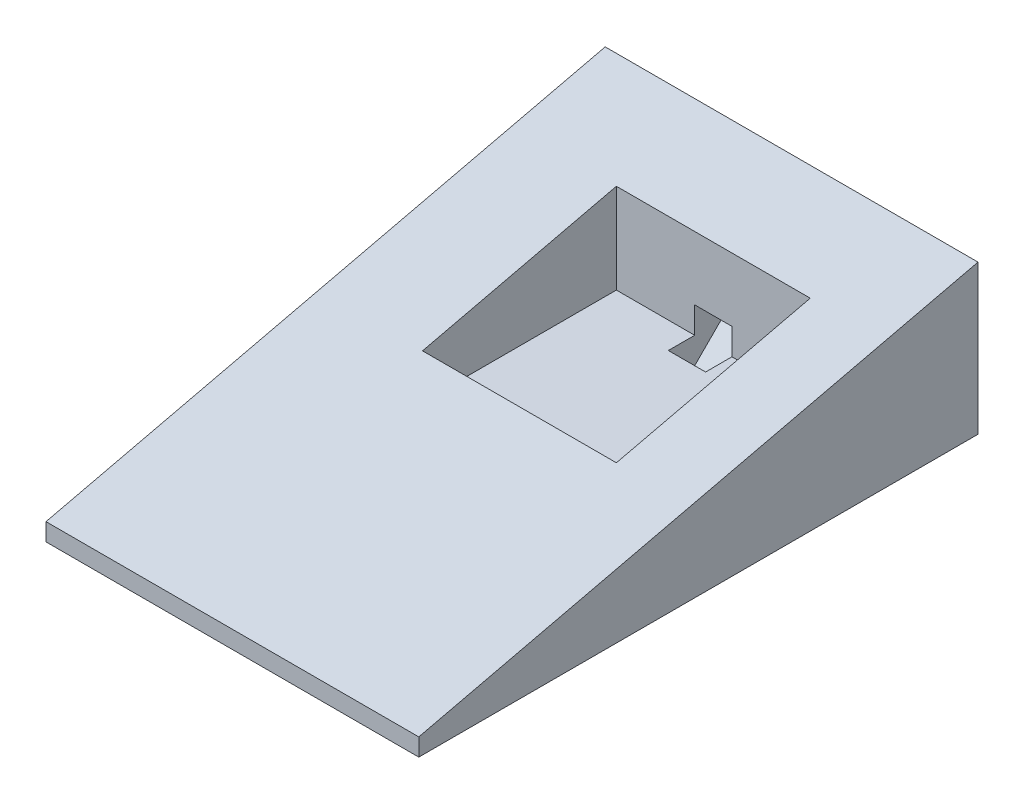
ISO-10303-21;
HEADER;
FILE_DESCRIPTION(('STEP AP214'),'2;1');
FILE_NAME('part.step','',(''),(''),'','','');
FILE_SCHEMA(('AUTOMOTIVE_DESIGN { 1 0 10303 214 1 1 1 1 }'));
ENDSEC;
DATA;
#1=APPLICATION_CONTEXT('core data for automotive mechanical design processes');
#2=APPLICATION_PROTOCOL_DEFINITION('international standard','automotive_design',2000,#1);
#3=PRODUCT_CONTEXT('',#1,'mechanical');
#4=PRODUCT('Part','Part','',(#3));
#5=PRODUCT_RELATED_PRODUCT_CATEGORY('part','',(#4));
#6=PRODUCT_DEFINITION_FORMATION('','',#4);
#7=PRODUCT_DEFINITION_CONTEXT('part definition',#1,'design');
#8=PRODUCT_DEFINITION('design','',#6,#7);
#9=PRODUCT_DEFINITION_SHAPE('','',#8);
#10=(LENGTH_UNIT() NAMED_UNIT(*) SI_UNIT(.MILLI.,.METRE.));
#11=(NAMED_UNIT(*) PLANE_ANGLE_UNIT() SI_UNIT($,.RADIAN.));
#12=(NAMED_UNIT(*) SI_UNIT($,.STERADIAN.) SOLID_ANGLE_UNIT());
#13=UNCERTAINTY_MEASURE_WITH_UNIT(LENGTH_MEASURE(1.E-05),#10,'distance_accuracy_value','');
#14=(GEOMETRIC_REPRESENTATION_CONTEXT(3) GLOBAL_UNCERTAINTY_ASSIGNED_CONTEXT((#13)) GLOBAL_UNIT_ASSIGNED_CONTEXT((#10,
#11,#12)) REPRESENTATION_CONTEXT('',''));
#15=CARTESIAN_POINT('',(0.,0.,0.));
#16=DIRECTION('',(0.,0.,1.));
#17=DIRECTION('',(1.,0.,0.));
#18=AXIS2_PLACEMENT_3D('',#15,#16,#17);
#19=CARTESIAN_POINT('',(0.,10.,0.));
#20=DIRECTION('',(0.,-1.,0.));
#21=DIRECTION('',(0.,0.,-1.));
#22=AXIS2_PLACEMENT_3D('',#19,#20,#21);
#23=PLANE('',#22);
#24=DIRECTION('',(0.,0.,1.));
#25=VECTOR('',#24,1.);
#26=CARTESIAN_POINT('',(-1.00000000000001,10.,0.));
#27=LINE('',#26,#25);
#28=CARTESIAN_POINT('',(-1.00000000000001,10.,-50.));
#29=VERTEX_POINT('',#28);
#30=CARTESIAN_POINT('',(-1.00000000000001,10.,-42.9289321881345));
#31=VERTEX_POINT('',#30);
#32=EDGE_CURVE('E135',#29,#31,#27,.T.);
#33=ORIENTED_EDGE('',*,*,#32,.F.);
#34=DIRECTION('',(-1.,0.,0.));
#35=VECTOR('',#34,1.);
#36=CARTESIAN_POINT('',(-22.,10.,-50.));
#37=LINE('',#36,#35);
#38=CARTESIAN_POINT('',(-22.,10.,-50.));
#39=VERTEX_POINT('',#38);
#40=EDGE_CURVE('E180',#29,#39,#37,.T.);
#41=ORIENTED_EDGE('',*,*,#40,.T.);
#42=DIRECTION('',(0.,0.,1.));
#43=VECTOR('',#42,1.);
#44=CARTESIAN_POINT('',(-22.,10.,2.00000000000002));
#45=LINE('',#44,#43);
#46=CARTESIAN_POINT('',(-22.,10.,2.00000000000002));
#47=VERTEX_POINT('',#46);
#48=EDGE_CURVE('E184',#39,#47,#45,.T.);
#49=ORIENTED_EDGE('',*,*,#48,.T.);
#50=DIRECTION('',(1.,0.,0.));
#51=VECTOR('',#50,1.);
#52=CARTESIAN_POINT('',(-22.,10.,2.00000000000002));
#53=LINE('',#52,#51);
#54=CARTESIAN_POINT('',(30.,10.,2.00000000000002));
#55=VERTEX_POINT('',#54);
#56=EDGE_CURVE('E187',#47,#55,#53,.T.);
#57=ORIENTED_EDGE('',*,*,#56,.T.);
#58=DIRECTION('',(0.,0.,-1.));
#59=VECTOR('',#58,1.);
#60=CARTESIAN_POINT('',(30.,10.,2.00000000000002));
#61=LINE('',#60,#59);
#62=CARTESIAN_POINT('',(30.,10.,-50.));
#63=VERTEX_POINT('',#62);
#64=EDGE_CURVE('E177',#55,#63,#61,.T.);
#65=ORIENTED_EDGE('',*,*,#64,.T.);
#66=CARTESIAN_POINT('',(8.99999999999998,10.,-50.));
#67=VERTEX_POINT('',#66);
#68=EDGE_CURVE('E181',#63,#67,#37,.T.);
#69=ORIENTED_EDGE('',*,*,#68,.T.);
#70=DIRECTION('',(0.,0.,-1.));
#71=VECTOR('',#70,1.);
#72=CARTESIAN_POINT('',(8.99999999999998,10.,0.));
#73=LINE('',#72,#71);
#74=CARTESIAN_POINT('',(8.99999999999998,10.,-42.9289321881345));
#75=VERTEX_POINT('',#74);
#76=EDGE_CURVE('E138',#75,#67,#73,.T.);
#77=ORIENTED_EDGE('',*,*,#76,.F.);
#78=DIRECTION('',(1.,0.,0.));
#79=VECTOR('',#78,1.);
#80=CARTESIAN_POINT('',(0.,10.,-42.9289321881345));
#81=LINE('',#80,#79);
#82=EDGE_CURVE('E11',#31,#75,#81,.T.);
#83=ORIENTED_EDGE('',*,*,#82,.F.);
#84=EDGE_LOOP('',(#33,#41,#49,#57,#65,#69,#77,#83));
#85=FACE_BOUND('',#84,.T.);
#86=ADVANCED_FACE('F33',(#85),#23,.F.);
#87=CARTESIAN_POINT('',(-22.,10.,-50.));
#88=DIRECTION('',(0.,0.,-1.));
#89=DIRECTION('',(-1.,0.,0.));
#90=AXIS2_PLACEMENT_3D('',#87,#88,#89);
#91=PLANE('',#90);
#92=DIRECTION('',(0.,-1.,0.));
#93=VECTOR('',#92,1.);
#94=CARTESIAN_POINT('',(-1.00000000000001,10.,-50.));
#95=LINE('',#94,#93);
#96=CARTESIAN_POINT('',(-1.00000000000001,17.0710678118655,-50.));
#97=VERTEX_POINT('',#96);
#98=EDGE_CURVE('E41',#97,#29,#95,.T.);
#99=ORIENTED_EDGE('',*,*,#98,.F.);
#100=DIRECTION('',(-1.,0.,0.));
#101=VECTOR('',#100,1.);
#102=CARTESIAN_POINT('',(-22.,17.0710678118655,-50.));
#103=LINE('',#102,#101);
#104=CARTESIAN_POINT('',(8.99999999999998,17.0710678118655,-50.));
#105=VERTEX_POINT('',#104);
#106=EDGE_CURVE('E227',#105,#97,#103,.T.);
#107=ORIENTED_EDGE('',*,*,#106,.F.);
#108=DIRECTION('',(0.,1.,0.));
#109=VECTOR('',#108,1.);
#110=CARTESIAN_POINT('',(8.99999999999998,10.,-50.));
#111=LINE('',#110,#109);
#112=EDGE_CURVE('E229',#67,#105,#111,.T.);
#113=ORIENTED_EDGE('',*,*,#112,.F.);
#114=ORIENTED_EDGE('',*,*,#68,.F.);
#115=DIRECTION('',(0.,1.,0.));
#116=VECTOR('',#115,1.);
#117=CARTESIAN_POINT('',(30.,10.,-50.));
#118=LINE('',#117,#116);
#119=CARTESIAN_POINT('',(30.,34.1176470588235,-50.));
#120=VERTEX_POINT('',#119);
#121=EDGE_CURVE('E190',#63,#120,#118,.T.);
#122=ORIENTED_EDGE('',*,*,#121,.T.);
#123=DIRECTION('',(-1.,0.,0.));
#124=VECTOR('',#123,1.);
#125=CARTESIAN_POINT('',(-22.,34.1176470588235,-50.));
#126=LINE('',#125,#124);
#127=CARTESIAN_POINT('',(-22.,34.1176470588235,-50.));
#128=VERTEX_POINT('',#127);
#129=EDGE_CURVE('E225',#120,#128,#126,.T.);
#130=ORIENTED_EDGE('',*,*,#129,.T.);
#131=DIRECTION('',(0.,1.,0.));
#132=VECTOR('',#131,1.);
#133=CARTESIAN_POINT('',(-22.,10.,-50.));
#134=LINE('',#133,#132);
#135=EDGE_CURVE('E198',#39,#128,#134,.T.);
#136=ORIENTED_EDGE('',*,*,#135,.F.);
#137=ORIENTED_EDGE('',*,*,#40,.F.);
#138=EDGE_LOOP('',(#99,#107,#113,#114,#122,#130,#136,#137));
#139=FACE_BOUND('',#138,.T.);
#140=ADVANCED_FACE('F237',(#139),#91,.F.);
#141=CARTESIAN_POINT('',(50.,40.,75.));
#142=DIRECTION('',(-1.,0.,0.));
#143=DIRECTION('',(0.,0.,1.));
#144=AXIS2_PLACEMENT_3D('',#141,#142,#143);
#145=PLANE('',#144);
#146=DIRECTION('',(0.,-1.,0.));
#147=VECTOR('',#146,1.);
#148=CARTESIAN_POINT('',(50.,40.,-75.));
#149=LINE('',#148,#147);
#150=CARTESIAN_POINT('',(50.,40.,-75.));
#151=VERTEX_POINT('',#150);
#152=CARTESIAN_POINT('',(50.,0.,-75.));
#153=VERTEX_POINT('',#152);
#154=EDGE_CURVE('E222',#151,#153,#149,.T.);
#155=ORIENTED_EDGE('',*,*,#154,.F.);
#156=DIRECTION('',(0.,0.229039333725547,-0.973417168333576));
#157=VECTOR('',#156,1.);
#158=CARTESIAN_POINT('',(50.,40.,-75.));
#159=LINE('',#158,#157);
#160=CARTESIAN_POINT('',(50.,4.70588235294117,75.));
#161=VERTEX_POINT('',#160);
#162=EDGE_CURVE('E162',#161,#151,#159,.T.);
#163=ORIENTED_EDGE('',*,*,#162,.F.);
#164=DIRECTION('',(0.,-1.,0.));
#165=VECTOR('',#164,1.);
#166=CARTESIAN_POINT('',(50.,40.,75.));
#167=LINE('',#166,#165);
#168=CARTESIAN_POINT('',(50.,0.,75.));
#169=VERTEX_POINT('',#168);
#170=EDGE_CURVE('E205',#161,#169,#167,.T.);
#171=ORIENTED_EDGE('',*,*,#170,.T.);
#172=DIRECTION('',(0.,0.,-1.));
#173=VECTOR('',#172,1.);
#174=CARTESIAN_POINT('',(50.,0.,75.));
#175=LINE('',#174,#173);
#176=EDGE_CURVE('E194',#169,#153,#175,.T.);
#177=ORIENTED_EDGE('',*,*,#176,.T.);
#178=EDGE_LOOP('',(#155,#163,#171,#177));
#179=FACE_BOUND('',#178,.T.);
#180=ADVANCED_FACE('F35',(#179),#145,.F.);
#181=CARTESIAN_POINT('',(-50.,40.,-75.));
#182=DIRECTION('',(0.,0.,1.));
#183=DIRECTION('',(1.,0.,0.));
#184=AXIS2_PLACEMENT_3D('',#181,#182,#183);
#185=PLANE('',#184);
#186=DIRECTION('',(-1.,0.,0.));
#187=VECTOR('',#186,1.);
#188=CARTESIAN_POINT('',(-50.,0.,-75.));
#189=LINE('',#188,#187);
#190=CARTESIAN_POINT('',(-50.,0.,-75.));
#191=VERTEX_POINT('',#190);
#192=EDGE_CURVE('E209',#153,#191,#189,.T.);
#193=ORIENTED_EDGE('',*,*,#192,.T.);
#194=DIRECTION('',(0.,-1.,0.));
#195=VECTOR('',#194,1.);
#196=CARTESIAN_POINT('',(-50.,40.,-75.));
#197=LINE('',#196,#195);
#198=CARTESIAN_POINT('',(-50.,40.,-75.));
#199=VERTEX_POINT('',#198);
#200=EDGE_CURVE('E219',#199,#191,#197,.T.);
#201=ORIENTED_EDGE('',*,*,#200,.F.);
#202=DIRECTION('',(-1.,0.,0.));
#203=VECTOR('',#202,1.);
#204=CARTESIAN_POINT('',(-50.,40.,-75.));
#205=LINE('',#204,#203);
#206=EDGE_CURVE('E203',#151,#199,#205,.T.);
#207=ORIENTED_EDGE('',*,*,#206,.F.);
#208=ORIENTED_EDGE('',*,*,#154,.T.);
#209=EDGE_LOOP('',(#193,#201,#207,#208));
#210=FACE_BOUND('',#209,.T.);
#211=ADVANCED_FACE('F286',(#210),#185,.F.);
#212=CARTESIAN_POINT('',(-50.,40.,75.));
#213=DIRECTION('',(1.,0.,0.));
#214=DIRECTION('',(0.,0.,-1.));
#215=AXIS2_PLACEMENT_3D('',#212,#213,#214);
#216=PLANE('',#215);
#217=DIRECTION('',(0.,-1.,0.));
#218=VECTOR('',#217,1.);
#219=CARTESIAN_POINT('',(-50.,40.,75.));
#220=LINE('',#219,#218);
#221=CARTESIAN_POINT('',(-50.,4.70588235294117,75.));
#222=VERTEX_POINT('',#221);
#223=CARTESIAN_POINT('',(-50.,0.,75.));
#224=VERTEX_POINT('',#223);
#225=EDGE_CURVE('E217',#222,#224,#220,.T.);
#226=ORIENTED_EDGE('',*,*,#225,.F.);
#227=DIRECTION('',(0.,0.229039333725547,-0.973417168333576));
#228=VECTOR('',#227,1.);
#229=CARTESIAN_POINT('',(-50.,40.,-75.));
#230=LINE('',#229,#228);
#231=EDGE_CURVE('E163',#222,#199,#230,.T.);
#232=ORIENTED_EDGE('',*,*,#231,.T.);
#233=ORIENTED_EDGE('',*,*,#200,.T.);
#234=DIRECTION('',(0.,0.,1.));
#235=VECTOR('',#234,1.);
#236=CARTESIAN_POINT('',(-50.,0.,75.));
#237=LINE('',#236,#235);
#238=EDGE_CURVE('E211',#191,#224,#237,.T.);
#239=ORIENTED_EDGE('',*,*,#238,.T.);
#240=EDGE_LOOP('',(#226,#232,#233,#239));
#241=FACE_BOUND('',#240,.T.);
#242=ADVANCED_FACE('F283',(#241),#216,.F.);
#243=CARTESIAN_POINT('',(-50.,40.,75.));
#244=DIRECTION('',(0.,0.,-1.));
#245=DIRECTION('',(-1.,0.,0.));
#246=AXIS2_PLACEMENT_3D('',#243,#244,#245);
#247=PLANE('',#246);
#248=ORIENTED_EDGE('',*,*,#170,.F.);
#249=DIRECTION('',(-1.,0.,0.));
#250=VECTOR('',#249,1.);
#251=CARTESIAN_POINT('',(-50.,4.70588235294118,75.));
#252=LINE('',#251,#250);
#253=EDGE_CURVE('E174',#161,#222,#252,.T.);
#254=ORIENTED_EDGE('',*,*,#253,.T.);
#255=ORIENTED_EDGE('',*,*,#225,.T.);
#256=DIRECTION('',(1.,0.,0.));
#257=VECTOR('',#256,1.);
#258=CARTESIAN_POINT('',(-50.,0.,75.));
#259=LINE('',#258,#257);
#260=EDGE_CURVE('E206',#224,#169,#259,.T.);
#261=ORIENTED_EDGE('',*,*,#260,.T.);
#262=EDGE_LOOP('',(#248,#254,#255,#261));
#263=FACE_BOUND('',#262,.T.);
#264=ADVANCED_FACE('F279',(#263),#247,.F.);
#265=CARTESIAN_POINT('',(0.,0.,0.));
#266=DIRECTION('',(0.,-1.,0.));
#267=DIRECTION('',(0.,0.,-1.));
#268=AXIS2_PLACEMENT_3D('',#265,#266,#267);
#269=PLANE('',#268);
#270=ORIENTED_EDGE('',*,*,#176,.F.);
#271=ORIENTED_EDGE('',*,*,#260,.F.);
#272=ORIENTED_EDGE('',*,*,#238,.F.);
#273=ORIENTED_EDGE('',*,*,#192,.F.);
#274=EDGE_LOOP('',(#270,#271,#272,#273));
#275=FACE_BOUND('',#274,.T.);
#276=ADVANCED_FACE('F276',(#275),#269,.T.);
#277=CARTESIAN_POINT('',(-50.,40.,-75.));
#278=DIRECTION('',(0.,-0.973417168333576,-0.229039333725547));
#279=DIRECTION('',(0.,0.229039333725547,-0.973417168333576));
#280=AXIS2_PLACEMENT_3D('',#277,#278,#279);
#281=PLANE('',#280);
#282=DIRECTION('',(1.,0.,0.));
#283=VECTOR('',#282,1.);
#284=CARTESIAN_POINT('',(-22.,21.8823529411765,2.00000000000002));
#285=LINE('',#284,#283);
#286=CARTESIAN_POINT('',(-22.,21.8823529411765,2.00000000000002));
#287=VERTEX_POINT('',#286);
#288=CARTESIAN_POINT('',(30.,21.8823529411765,2.00000000000002));
#289=VERTEX_POINT('',#288);
#290=EDGE_CURVE('E168',#287,#289,#285,.T.);
#291=ORIENTED_EDGE('',*,*,#290,.F.);
#292=DIRECTION('',(0.,-0.229039333725547,0.973417168333576));
#293=VECTOR('',#292,1.);
#294=CARTESIAN_POINT('',(-22.,21.2590163934426,4.64918032786887));
#295=LINE('',#294,#293);
#296=EDGE_CURVE('E56',#128,#287,#295,.T.);
#297=ORIENTED_EDGE('',*,*,#296,.F.);
#298=ORIENTED_EDGE('',*,*,#129,.F.);
#299=DIRECTION('',(0.,0.229039333725547,-0.973417168333576));
#300=VECTOR('',#299,1.);
#301=CARTESIAN_POINT('',(30.,21.2590163934426,4.64918032786887));
#302=LINE('',#301,#300);
#303=EDGE_CURVE('E171',#289,#120,#302,.T.);
#304=ORIENTED_EDGE('',*,*,#303,.F.);
#305=EDGE_LOOP('',(#291,#297,#298,#304));
#306=FACE_BOUND('',#305,.T.);
#307=ORIENTED_EDGE('',*,*,#162,.T.);
#308=ORIENTED_EDGE('',*,*,#206,.T.);
#309=ORIENTED_EDGE('',*,*,#231,.F.);
#310=ORIENTED_EDGE('',*,*,#253,.F.);
#311=EDGE_LOOP('',(#307,#308,#309,#310));
#312=FACE_BOUND('',#311,.T.);
#313=ADVANCED_FACE('F268',(#306,#312),#281,.F.);
#314=CARTESIAN_POINT('',(-22.,10.,2.00000000000002));
#315=DIRECTION('',(-1.,0.,0.));
#316=DIRECTION('',(0.,0.,1.));
#317=AXIS2_PLACEMENT_3D('',#314,#315,#316);
#318=PLANE('',#317);
#319=ORIENTED_EDGE('',*,*,#135,.T.);
#320=ORIENTED_EDGE('',*,*,#296,.T.);
#321=DIRECTION('',(0.,1.,0.));
#322=VECTOR('',#321,1.);
#323=CARTESIAN_POINT('',(-22.,10.,2.00000000000002));
#324=LINE('',#323,#322);
#325=EDGE_CURVE('E195',#47,#287,#324,.T.);
#326=ORIENTED_EDGE('',*,*,#325,.F.);
#327=ORIENTED_EDGE('',*,*,#48,.F.);
#328=EDGE_LOOP('',(#319,#320,#326,#327));
#329=FACE_BOUND('',#328,.T.);
#330=ADVANCED_FACE('F240',(#329),#318,.F.);
#331=CARTESIAN_POINT('',(-22.,10.,2.00000000000002));
#332=DIRECTION('',(0.,0.,1.));
#333=DIRECTION('',(1.,0.,0.));
#334=AXIS2_PLACEMENT_3D('',#331,#332,#333);
#335=PLANE('',#334);
#336=ORIENTED_EDGE('',*,*,#325,.T.);
#337=ORIENTED_EDGE('',*,*,#290,.T.);
#338=DIRECTION('',(0.,1.,0.));
#339=VECTOR('',#338,1.);
#340=CARTESIAN_POINT('',(30.,10.,2.00000000000002));
#341=LINE('',#340,#339);
#342=EDGE_CURVE('E191',#55,#289,#341,.T.);
#343=ORIENTED_EDGE('',*,*,#342,.F.);
#344=ORIENTED_EDGE('',*,*,#56,.F.);
#345=EDGE_LOOP('',(#336,#337,#343,#344));
#346=FACE_BOUND('',#345,.T.);
#347=ADVANCED_FACE('F243',(#346),#335,.F.);
#348=CARTESIAN_POINT('',(30.,10.,2.00000000000002));
#349=DIRECTION('',(1.,0.,0.));
#350=DIRECTION('',(0.,0.,-1.));
#351=AXIS2_PLACEMENT_3D('',#348,#349,#350);
#352=PLANE('',#351);
#353=ORIENTED_EDGE('',*,*,#342,.T.);
#354=ORIENTED_EDGE('',*,*,#303,.T.);
#355=ORIENTED_EDGE('',*,*,#121,.F.);
#356=ORIENTED_EDGE('',*,*,#64,.F.);
#357=EDGE_LOOP('',(#353,#354,#355,#356));
#358=FACE_BOUND('',#357,.T.);
#359=ADVANCED_FACE('F246',(#358),#352,.F.);
#360=CARTESIAN_POINT('',(8.99999999999998,13.5355339059327,-39.3933982822018));
#361=DIRECTION('',(0.,0.707106781186547,-0.707106781186548));
#362=DIRECTION('',(0.,0.707106781186548,0.707106781186547));
#363=AXIS2_PLACEMENT_3D('',#360,#361,#362);
#364=PLANE('',#363);
#365=ORIENTED_EDGE('',*,*,#82,.T.);
#366=DIRECTION('',(0.,-0.707106781186548,-0.707106781186547));
#367=VECTOR('',#366,1.);
#368=CARTESIAN_POINT('',(8.99999999999998,13.5355339059327,-39.3933982822018));
#369=LINE('',#368,#367);
#370=CARTESIAN_POINT('',(8.99999999999998,2.92893218813451,-50.));
#371=VERTEX_POINT('',#370);
#372=EDGE_CURVE('E139',#75,#371,#369,.T.);
#373=ORIENTED_EDGE('',*,*,#372,.T.);
#374=DIRECTION('',(1.,0.,0.));
#375=VECTOR('',#374,1.);
#376=CARTESIAN_POINT('',(8.99999999999998,2.92893218813451,-50.));
#377=LINE('',#376,#375);
#378=CARTESIAN_POINT('',(-1.00000000000001,2.92893218813451,-50.));
#379=VERTEX_POINT('',#378);
#380=EDGE_CURVE('E142',#379,#371,#377,.T.);
#381=ORIENTED_EDGE('',*,*,#380,.F.);
#382=DIRECTION('',(0.,-0.707106781186548,-0.707106781186547));
#383=VECTOR('',#382,1.);
#384=CARTESIAN_POINT('',(-1.00000000000001,13.5355339059327,-39.3933982822018));
#385=LINE('',#384,#383);
#386=EDGE_CURVE('E127',#31,#379,#385,.T.);
#387=ORIENTED_EDGE('',*,*,#386,.F.);
#388=EDGE_LOOP('',(#365,#373,#381,#387));
#389=FACE_BOUND('',#388,.T.);
#390=ADVANCED_FACE('F143',(#389),#364,.T.);
#391=CARTESIAN_POINT('',(-1.00000000000001,20.6066017177982,-46.4644660940672));
#392=DIRECTION('',(1.,0.,0.));
#393=DIRECTION('',(0.,0.,-1.));
#394=AXIS2_PLACEMENT_3D('',#391,#392,#393);
#395=PLANE('',#394);
#396=ORIENTED_EDGE('',*,*,#32,.T.);
#397=ORIENTED_EDGE('',*,*,#386,.T.);
#398=DIRECTION('',(0.,-0.707106781186547,0.707106781186548));
#399=VECTOR('',#398,1.);
#400=CARTESIAN_POINT('',(-1.00000000000001,9.99999999999998,-57.0710678118655));
#401=LINE('',#400,#399);
#402=CARTESIAN_POINT('',(-1.00000000000001,9.99999999999998,-57.0710678118655));
#403=VERTEX_POINT('',#402);
#404=EDGE_CURVE('E132',#403,#379,#401,.T.);
#405=ORIENTED_EDGE('',*,*,#404,.F.);
#406=DIRECTION('',(0.,-0.707106781186548,-0.707106781186547));
#407=VECTOR('',#406,1.);
#408=CARTESIAN_POINT('',(-1.00000000000001,20.6066017177982,-46.4644660940672));
#409=LINE('',#408,#407);
#410=EDGE_CURVE('E156',#97,#403,#409,.T.);
#411=ORIENTED_EDGE('',*,*,#410,.F.);
#412=ORIENTED_EDGE('',*,*,#98,.T.);
#413=EDGE_LOOP('',(#396,#397,#405,#411,#412));
#414=FACE_BOUND('',#413,.T.);
#415=ADVANCED_FACE('F129',(#414),#395,.T.);
#416=CARTESIAN_POINT('',(8.99999999999998,20.6066017177982,-46.4644660940672));
#417=DIRECTION('',(-1.,0.,0.));
#418=DIRECTION('',(0.,0.,1.));
#419=AXIS2_PLACEMENT_3D('',#416,#417,#418);
#420=PLANE('',#419);
#421=ORIENTED_EDGE('',*,*,#76,.T.);
#422=ORIENTED_EDGE('',*,*,#112,.T.);
#423=DIRECTION('',(0.,-0.707106781186548,-0.707106781186547));
#424=VECTOR('',#423,1.);
#425=CARTESIAN_POINT('',(8.99999999999998,20.6066017177982,-46.4644660940672));
#426=LINE('',#425,#424);
#427=CARTESIAN_POINT('',(8.99999999999998,9.99999999999998,-57.0710678118655));
#428=VERTEX_POINT('',#427);
#429=EDGE_CURVE('E48',#105,#428,#426,.T.);
#430=ORIENTED_EDGE('',*,*,#429,.T.);
#431=DIRECTION('',(0.,0.707106781186547,-0.707106781186548));
#432=VECTOR('',#431,1.);
#433=CARTESIAN_POINT('',(8.99999999999998,9.99999999999998,-57.0710678118655));
#434=LINE('',#433,#432);
#435=EDGE_CURVE('E148',#371,#428,#434,.T.);
#436=ORIENTED_EDGE('',*,*,#435,.F.);
#437=ORIENTED_EDGE('',*,*,#372,.F.);
#438=EDGE_LOOP('',(#421,#422,#430,#436,#437));
#439=FACE_BOUND('',#438,.T.);
#440=ADVANCED_FACE('F250',(#439),#420,.T.);
#441=CARTESIAN_POINT('',(8.99999999999998,20.6066017177982,-46.4644660940672));
#442=DIRECTION('',(0.,-0.707106781186547,0.707106781186548));
#443=DIRECTION('',(0.,-0.707106781186548,-0.707106781186547));
#444=AXIS2_PLACEMENT_3D('',#441,#442,#443);
#445=PLANE('',#444);
#446=ORIENTED_EDGE('',*,*,#106,.T.);
#447=ORIENTED_EDGE('',*,*,#410,.T.);
#448=DIRECTION('',(-1.,0.,0.));
#449=VECTOR('',#448,1.);
#450=CARTESIAN_POINT('',(8.99999999999998,9.99999999999998,-57.0710678118655));
#451=LINE('',#450,#449);
#452=EDGE_CURVE('E151',#428,#403,#451,.T.);
#453=ORIENTED_EDGE('',*,*,#452,.F.);
#454=ORIENTED_EDGE('',*,*,#429,.F.);
#455=EDGE_LOOP('',(#446,#447,#453,#454));
#456=FACE_BOUND('',#455,.T.);
#457=ADVANCED_FACE('F251',(#456),#445,.T.);
#458=CARTESIAN_POINT('',(0.,-23.5355339059327,-23.5355339059327));
#459=DIRECTION('',(0.,-0.707106781186548,-0.707106781186547));
#460=DIRECTION('',(0.,0.707106781186547,-0.707106781186548));
#461=AXIS2_PLACEMENT_3D('',#458,#459,#460);
#462=PLANE('',#461);
#463=ORIENTED_EDGE('',*,*,#404,.T.);
#464=ORIENTED_EDGE('',*,*,#380,.T.);
#465=ORIENTED_EDGE('',*,*,#435,.T.);
#466=ORIENTED_EDGE('',*,*,#452,.T.);
#467=EDGE_LOOP('',(#463,#464,#465,#466));
#468=FACE_BOUND('',#467,.T.);
#469=ADVANCED_FACE('F150',(#468),#462,.F.);
#470=CLOSED_SHELL('',(#86,#140,#180,#211,#242,#264,#276,#313,#330,#347,#359,#390,#415,#440,#457,#469));
#471=MANIFOLD_SOLID_BREP('B2',#470);
#472=ADVANCED_BREP_SHAPE_REPRESENTATION('',(#18,#471),#14);
#473=SHAPE_DEFINITION_REPRESENTATION(#9,#472);
ENDSEC;
END-ISO-10303-21;
